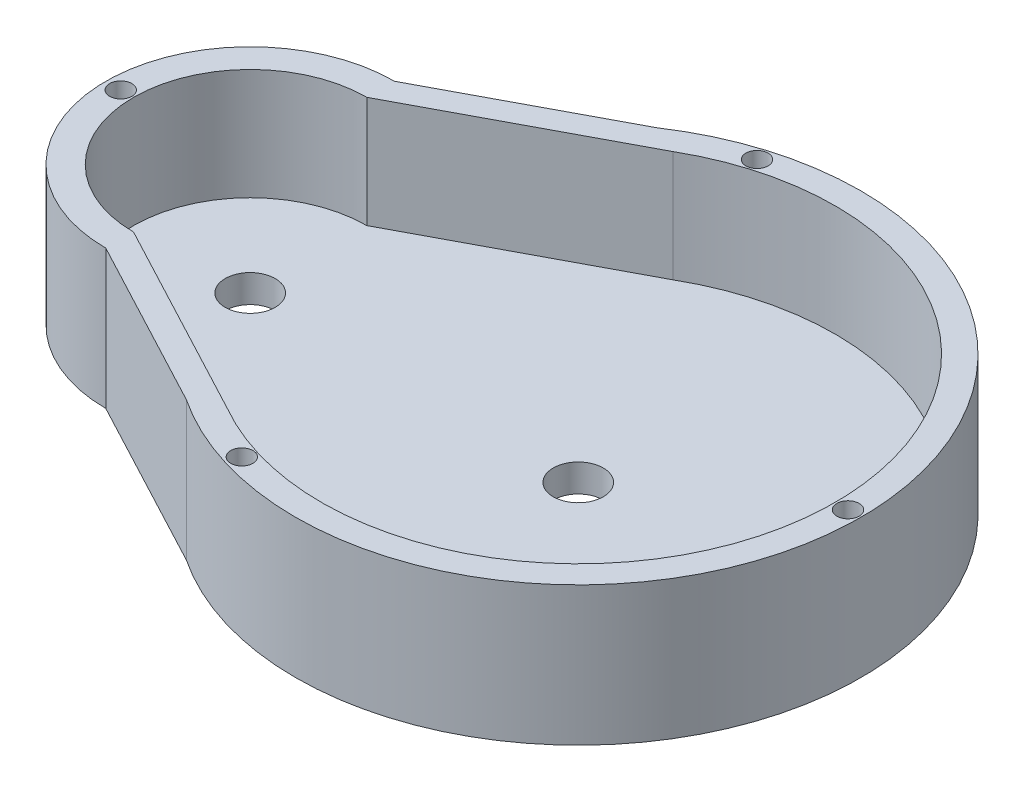
ISO-10303-21;
HEADER;
FILE_DESCRIPTION(('STEP AP214'),'2;1');
FILE_NAME('part.step','',(''),(''),'','','');
FILE_SCHEMA(('AUTOMOTIVE_DESIGN { 1 0 10303 214 1 1 1 1 }'));
ENDSEC;
DATA;
#1=APPLICATION_CONTEXT('core data for automotive mechanical design processes');
#2=APPLICATION_PROTOCOL_DEFINITION('international standard','automotive_design',2000,#1);
#3=PRODUCT_CONTEXT('',#1,'mechanical');
#4=PRODUCT('Part','Part','',(#3));
#5=PRODUCT_RELATED_PRODUCT_CATEGORY('part','',(#4));
#6=PRODUCT_DEFINITION_FORMATION('','',#4);
#7=PRODUCT_DEFINITION_CONTEXT('part definition',#1,'design');
#8=PRODUCT_DEFINITION('design','',#6,#7);
#9=PRODUCT_DEFINITION_SHAPE('','',#8);
#10=(LENGTH_UNIT() NAMED_UNIT(*) SI_UNIT(.MILLI.,.METRE.));
#11=(NAMED_UNIT(*) PLANE_ANGLE_UNIT() SI_UNIT($,.RADIAN.));
#12=(NAMED_UNIT(*) SI_UNIT($,.STERADIAN.) SOLID_ANGLE_UNIT());
#13=UNCERTAINTY_MEASURE_WITH_UNIT(LENGTH_MEASURE(1.E-05),#10,'distance_accuracy_value','');
#14=(GEOMETRIC_REPRESENTATION_CONTEXT(3) GLOBAL_UNCERTAINTY_ASSIGNED_CONTEXT((#13)) GLOBAL_UNIT_ASSIGNED_CONTEXT((#10,
#11,#12)) REPRESENTATION_CONTEXT('',''));
#15=CARTESIAN_POINT('',(0.,0.,0.));
#16=DIRECTION('',(0.,0.,1.));
#17=DIRECTION('',(1.,0.,0.));
#18=AXIS2_PLACEMENT_3D('',#15,#16,#17);
#19=CARTESIAN_POINT('',(0.,5.,0.));
#20=DIRECTION('',(0.,1.,0.));
#21=DIRECTION('',(0.,0.,1.));
#22=AXIS2_PLACEMENT_3D('',#19,#20,#21);
#23=PLANE('',#22);
#24=CARTESIAN_POINT('',(59.055,5.,0.));
#25=DIRECTION('',(0.,1.,0.));
#26=DIRECTION('',(0.,0.,1.));
#27=AXIS2_PLACEMENT_3D('',#24,#25,#26);
#28=CIRCLE('',#27,4.5);
#29=CARTESIAN_POINT('',(59.055,5.,4.5));
#30=VERTEX_POINT('',#29);
#31=EDGE_CURVE('E159',#30,#30,#28,.T.);
#32=ORIENTED_EDGE('',*,*,#31,.F.);
#33=EDGE_LOOP('',(#32));
#34=FACE_BOUND('',#33,.T.);
#35=CARTESIAN_POINT('',(0.,5.,0.));
#36=DIRECTION('',(0.,1.,0.));
#37=DIRECTION('',(0.,0.,1.));
#38=AXIS2_PLACEMENT_3D('',#35,#36,#37);
#39=CIRCLE('',#38,4.5);
#40=CARTESIAN_POINT('',(0.,5.,4.5));
#41=VERTEX_POINT('',#40);
#42=EDGE_CURVE('E156',#41,#41,#39,.T.);
#43=ORIENTED_EDGE('',*,*,#42,.F.);
#44=EDGE_LOOP('',(#43));
#45=FACE_BOUND('',#44,.T.);
#46=CARTESIAN_POINT('',(59.055,5.,0.));
#47=DIRECTION('',(0.,1.,0.));
#48=DIRECTION('',(0.,0.,1.));
#49=AXIS2_PLACEMENT_3D('',#46,#47,#48);
#50=CIRCLE('',#49,46.2469937677163);
#51=CARTESIAN_POINT('',(35.9898259140856,5.,40.0846875619313));
#52=VERTEX_POINT('',#51);
#53=CARTESIAN_POINT('',(35.9898259140857,5.,-40.0846875619313));
#54=VERTEX_POINT('',#53);
#55=EDGE_CURVE('E54',#52,#54,#50,.T.);
#56=ORIENTED_EDGE('',*,*,#55,.T.);
#57=DIRECTION('',(0.883470496277918,0.,-0.468486800461283));
#58=VECTOR('',#57,1.);
#59=CARTESIAN_POINT('',(-8.69177958816686,5.,-16.3909224736645));
#60=LINE('',#59,#58);
#61=CARTESIAN_POINT('',(0.,5.,-21.));
#62=VERTEX_POINT('',#61);
#63=EDGE_CURVE('E121',#62,#54,#60,.T.);
#64=ORIENTED_EDGE('',*,*,#63,.F.);
#65=CARTESIAN_POINT('',(0.,5.,0.));
#66=DIRECTION('',(0.,1.,0.));
#67=DIRECTION('',(0.,0.,1.));
#68=AXIS2_PLACEMENT_3D('',#65,#66,#67);
#69=CIRCLE('',#68,21.);
#70=CARTESIAN_POINT('',(0.,5.,21.));
#71=VERTEX_POINT('',#70);
#72=EDGE_CURVE('E116',#62,#71,#69,.T.);
#73=ORIENTED_EDGE('',*,*,#72,.T.);
#74=DIRECTION('',(0.883470496277919,0.,0.468486800461281));
#75=VECTOR('',#74,1.);
#76=CARTESIAN_POINT('',(-8.69177958816683,5.,16.3909224736646));
#77=LINE('',#76,#75);
#78=EDGE_CURVE('E59',#71,#52,#77,.T.);
#79=ORIENTED_EDGE('',*,*,#78,.T.);
#80=EDGE_LOOP('',(#56,#64,#73,#79));
#81=FACE_BOUND('',#80,.T.);
#82=ADVANCED_FACE('F39',(#34,#45,#81),#23,.T.);
#83=CARTESIAN_POINT('',(-10.7612509186828,5.,20.2935230626323));
#84=DIRECTION('',(0.468486800461283,0.,-0.883470496277918));
#85=DIRECTION('',(-0.883470496277918,0.,-0.468486800461283));
#86=AXIS2_PLACEMENT_3D('',#83,#84,#85);
#87=PLANE('',#86);
#88=DIRECTION('',(0.883470496277918,0.,0.468486800461283));
#89=VECTOR('',#88,1.);
#90=CARTESIAN_POINT('',(-10.7612509186828,0.,20.2935230626323));
#91=LINE('',#90,#89);
#92=CARTESIAN_POINT('',(0.,0.,26.));
#93=VERTEX_POINT('',#92);
#94=CARTESIAN_POINT('',(30.8523245113899,0.,42.3603729360844));
#95=VERTEX_POINT('',#94);
#96=EDGE_CURVE('E123',#93,#95,#91,.T.);
#97=ORIENTED_EDGE('',*,*,#96,.T.);
#98=DIRECTION('',(0.,-1.,0.));
#99=VECTOR('',#98,1.);
#100=CARTESIAN_POINT('',(30.8523245113899,5.,42.3603729360844));
#101=LINE('',#100,#99);
#102=CARTESIAN_POINT('',(30.8523245113898,25.,42.3603729360843));
#103=VERTEX_POINT('',#102);
#104=EDGE_CURVE('E12',#103,#95,#101,.T.);
#105=ORIENTED_EDGE('',*,*,#104,.F.);
#106=DIRECTION('',(0.883470496277918,0.,0.468486800461283));
#107=VECTOR('',#106,1.);
#108=CARTESIAN_POINT('',(-10.7612509186828,25.,20.2935230626323));
#109=LINE('',#108,#107);
#110=CARTESIAN_POINT('',(0.,25.,26.));
#111=VERTEX_POINT('',#110);
#112=EDGE_CURVE('E142',#111,#103,#109,.T.);
#113=ORIENTED_EDGE('',*,*,#112,.F.);
#114=DIRECTION('',(0.,-1.,0.));
#115=VECTOR('',#114,1.);
#116=CARTESIAN_POINT('',(0.,5.,26.));
#117=LINE('',#116,#115);
#118=EDGE_CURVE('E163',#111,#93,#117,.T.);
#119=ORIENTED_EDGE('',*,*,#118,.T.);
#120=EDGE_LOOP('',(#97,#105,#113,#119));
#121=FACE_BOUND('',#120,.T.);
#122=ADVANCED_FACE('F41',(#121),#87,.F.);
#123=CARTESIAN_POINT('',(59.055,5.,0.));
#124=DIRECTION('',(0.,-1.,0.));
#125=DIRECTION('',(0.,0.,-1.));
#126=AXIS2_PLACEMENT_3D('',#123,#124,#125);
#127=CYLINDRICAL_SURFACE('',#126,50.89);
#128=CARTESIAN_POINT('',(59.055,0.,0.));
#129=DIRECTION('',(0.,1.,0.));
#130=DIRECTION('',(0.,0.,1.));
#131=AXIS2_PLACEMENT_3D('',#128,#129,#130);
#132=CIRCLE('',#131,50.89);
#133=CARTESIAN_POINT('',(30.8523245113899,0.,-42.3603729360844));
#134=VERTEX_POINT('',#133);
#135=EDGE_CURVE('E166',#95,#134,#132,.T.);
#136=ORIENTED_EDGE('',*,*,#135,.T.);
#137=DIRECTION('',(0.,-1.,0.));
#138=VECTOR('',#137,1.);
#139=CARTESIAN_POINT('',(30.8523245113899,5.,-42.3603729360844));
#140=LINE('',#139,#138);
#141=CARTESIAN_POINT('',(30.8523245113899,25.,-42.3603729360844));
#142=VERTEX_POINT('',#141);
#143=EDGE_CURVE('E47',#142,#134,#140,.T.);
#144=ORIENTED_EDGE('',*,*,#143,.F.);
#145=CARTESIAN_POINT('',(59.055,25.,0.));
#146=DIRECTION('',(0.,1.,0.));
#147=DIRECTION('',(0.,0.,1.));
#148=AXIS2_PLACEMENT_3D('',#145,#146,#147);
#149=CIRCLE('',#148,50.89);
#150=EDGE_CURVE('E133',#103,#142,#149,.T.);
#151=ORIENTED_EDGE('',*,*,#150,.F.);
#152=ORIENTED_EDGE('',*,*,#104,.T.);
#153=EDGE_LOOP('',(#136,#144,#151,#152));
#154=FACE_BOUND('',#153,.T.);
#155=ADVANCED_FACE('F188',(#154),#127,.T.);
#156=CARTESIAN_POINT('',(-10.7612509186828,5.,-20.2935230626323));
#157=DIRECTION('',(-0.468486800461283,0.,-0.883470496277917));
#158=DIRECTION('',(-0.883470496277917,0.,0.468486800461283));
#159=AXIS2_PLACEMENT_3D('',#156,#157,#158);
#160=PLANE('',#159);
#161=DIRECTION('',(0.883470496277917,0.,-0.468486800461283));
#162=VECTOR('',#161,1.);
#163=CARTESIAN_POINT('',(-10.7612509186828,0.,-20.2935230626323));
#164=LINE('',#163,#162);
#165=CARTESIAN_POINT('',(0.,0.,-26.));
#166=VERTEX_POINT('',#165);
#167=EDGE_CURVE('E169',#166,#134,#164,.T.);
#168=ORIENTED_EDGE('',*,*,#167,.F.);
#169=DIRECTION('',(0.,-1.,0.));
#170=VECTOR('',#169,1.);
#171=CARTESIAN_POINT('',(0.,5.,-26.));
#172=LINE('',#171,#170);
#173=CARTESIAN_POINT('',(0.,25.,-26.));
#174=VERTEX_POINT('',#173);
#175=EDGE_CURVE('E181',#174,#166,#172,.T.);
#176=ORIENTED_EDGE('',*,*,#175,.F.);
#177=DIRECTION('',(-0.883470496277917,0.,0.468486800461283));
#178=VECTOR('',#177,1.);
#179=CARTESIAN_POINT('',(-10.7612509186828,25.,-20.2935230626323));
#180=LINE('',#179,#178);
#181=EDGE_CURVE('E136',#142,#174,#180,.T.);
#182=ORIENTED_EDGE('',*,*,#181,.F.);
#183=ORIENTED_EDGE('',*,*,#143,.T.);
#184=EDGE_LOOP('',(#168,#176,#182,#183));
#185=FACE_BOUND('',#184,.T.);
#186=ADVANCED_FACE('F185',(#185),#160,.T.);
#187=CARTESIAN_POINT('',(0.,5.,0.));
#188=DIRECTION('',(0.,-1.,0.));
#189=DIRECTION('',(0.,0.,-1.));
#190=AXIS2_PLACEMENT_3D('',#187,#188,#189);
#191=CYLINDRICAL_SURFACE('',#190,4.5);
#192=ORIENTED_EDGE('',*,*,#42,.T.);
#193=EDGE_LOOP('',(#192));
#194=FACE_BOUND('',#193,.T.);
#195=CARTESIAN_POINT('',(0.,0.,0.));
#196=DIRECTION('',(0.,1.,0.));
#197=DIRECTION('',(0.,0.,1.));
#198=AXIS2_PLACEMENT_3D('',#195,#196,#197);
#199=CIRCLE('',#198,4.5);
#200=CARTESIAN_POINT('',(0.,0.,4.5));
#201=VERTEX_POINT('',#200);
#202=EDGE_CURVE('E175',#201,#201,#199,.T.);
#203=ORIENTED_EDGE('',*,*,#202,.F.);
#204=EDGE_LOOP('',(#203));
#205=FACE_BOUND('',#204,.T.);
#206=ADVANCED_FACE('F220',(#194,#205),#191,.F.);
#207=CARTESIAN_POINT('',(0.,5.,0.));
#208=DIRECTION('',(0.,-1.,0.));
#209=DIRECTION('',(0.,0.,-1.));
#210=AXIS2_PLACEMENT_3D('',#207,#208,#209);
#211=CYLINDRICAL_SURFACE('',#210,26.);
#212=CARTESIAN_POINT('',(0.,0.,0.));
#213=DIRECTION('',(0.,1.,0.));
#214=DIRECTION('',(0.,0.,1.));
#215=AXIS2_PLACEMENT_3D('',#212,#213,#214);
#216=CIRCLE('',#215,26.);
#217=EDGE_CURVE('E172',#93,#166,#216,.F.);
#218=ORIENTED_EDGE('',*,*,#217,.F.);
#219=ORIENTED_EDGE('',*,*,#118,.F.);
#220=CARTESIAN_POINT('',(0.,25.,0.));
#221=DIRECTION('',(0.,1.,0.));
#222=DIRECTION('',(0.,0.,1.));
#223=AXIS2_PLACEMENT_3D('',#220,#221,#222);
#224=CIRCLE('',#223,26.);
#225=EDGE_CURVE('E139',#174,#111,#224,.T.);
#226=ORIENTED_EDGE('',*,*,#225,.F.);
#227=ORIENTED_EDGE('',*,*,#175,.T.);
#228=EDGE_LOOP('',(#218,#219,#226,#227));
#229=FACE_BOUND('',#228,.T.);
#230=ADVANCED_FACE('F195',(#229),#211,.T.);
#231=CARTESIAN_POINT('',(59.055,5.,0.));
#232=DIRECTION('',(0.,-1.,0.));
#233=DIRECTION('',(0.,0.,-1.));
#234=AXIS2_PLACEMENT_3D('',#231,#232,#233);
#235=CYLINDRICAL_SURFACE('',#234,4.5);
#236=ORIENTED_EDGE('',*,*,#31,.T.);
#237=EDGE_LOOP('',(#236));
#238=FACE_BOUND('',#237,.T.);
#239=CARTESIAN_POINT('',(59.055,0.,0.));
#240=DIRECTION('',(0.,1.,0.));
#241=DIRECTION('',(0.,0.,1.));
#242=AXIS2_PLACEMENT_3D('',#239,#240,#241);
#243=CIRCLE('',#242,4.5);
#244=CARTESIAN_POINT('',(59.055,0.,4.5));
#245=VERTEX_POINT('',#244);
#246=EDGE_CURVE('E160',#245,#245,#243,.T.);
#247=ORIENTED_EDGE('',*,*,#246,.F.);
#248=EDGE_LOOP('',(#247));
#249=FACE_BOUND('',#248,.T.);
#250=ADVANCED_FACE('F215',(#238,#249),#235,.F.);
#251=CARTESIAN_POINT('',(0.,0.,0.));
#252=DIRECTION('',(0.,1.,0.));
#253=DIRECTION('',(0.,0.,1.));
#254=AXIS2_PLACEMENT_3D('',#251,#252,#253);
#255=PLANE('',#254);
#256=CARTESIAN_POINT('',(-23.3,0.,0.));
#257=DIRECTION('',(0.,1.,0.));
#258=DIRECTION('',(0.,0.,1.));
#259=AXIS2_PLACEMENT_3D('',#256,#257,#258);
#260=CIRCLE('',#259,2.);
#261=CARTESIAN_POINT('',(-23.3,0.,2.));
#262=VERTEX_POINT('',#261);
#263=EDGE_CURVE('E147',#262,#262,#260,.T.);
#264=ORIENTED_EDGE('',*,*,#263,.T.);
#265=EDGE_LOOP('',(#264));
#266=FACE_BOUND('',#265,.T.);
#267=CARTESIAN_POINT('',(107.605,0.,0.));
#268=DIRECTION('',(0.,1.,0.));
#269=DIRECTION('',(0.,0.,1.));
#270=AXIS2_PLACEMENT_3D('',#267,#268,#269);
#271=CIRCLE('',#270,2.);
#272=CARTESIAN_POINT('',(107.605,0.,2.));
#273=VERTEX_POINT('',#272);
#274=EDGE_CURVE('E463',#273,#273,#271,.T.);
#275=ORIENTED_EDGE('',*,*,#274,.T.);
#276=EDGE_LOOP('',(#275));
#277=FACE_BOUND('',#276,.T.);
#278=CARTESIAN_POINT('',(44.8118478498742,0.,-46.4228622133697));
#279=DIRECTION('',(0.,1.,0.));
#280=DIRECTION('',(0.,0.,1.));
#281=AXIS2_PLACEMENT_3D('',#278,#279,#280);
#282=CIRCLE('',#281,2.);
#283=CARTESIAN_POINT('',(44.8118478498742,0.,-44.4228622133697));
#284=VERTEX_POINT('',#283);
#285=EDGE_CURVE('E465',#284,#284,#282,.T.);
#286=ORIENTED_EDGE('',*,*,#285,.T.);
#287=EDGE_LOOP('',(#286));
#288=FACE_BOUND('',#287,.T.);
#289=CARTESIAN_POINT('',(44.8118478498742,0.,46.3169661641118));
#290=DIRECTION('',(0.,1.,0.));
#291=DIRECTION('',(0.,0.,1.));
#292=AXIS2_PLACEMENT_3D('',#289,#290,#291);
#293=CIRCLE('',#292,2.);
#294=CARTESIAN_POINT('',(44.8118478498742,0.,48.3169661641118));
#295=VERTEX_POINT('',#294);
#296=EDGE_CURVE('E470',#295,#295,#293,.T.);
#297=ORIENTED_EDGE('',*,*,#296,.T.);
#298=EDGE_LOOP('',(#297));
#299=FACE_BOUND('',#298,.T.);
#300=ORIENTED_EDGE('',*,*,#96,.F.);
#301=ORIENTED_EDGE('',*,*,#217,.T.);
#302=ORIENTED_EDGE('',*,*,#167,.T.);
#303=ORIENTED_EDGE('',*,*,#135,.F.);
#304=EDGE_LOOP('',(#300,#301,#302,#303));
#305=FACE_BOUND('',#304,.T.);
#306=ORIENTED_EDGE('',*,*,#202,.T.);
#307=EDGE_LOOP('',(#306));
#308=FACE_BOUND('',#307,.T.);
#309=ORIENTED_EDGE('',*,*,#246,.T.);
#310=EDGE_LOOP('',(#309));
#311=FACE_BOUND('',#310,.T.);
#312=ADVANCED_FACE('F191',(#266,#277,#288,#299,#305,#308,#311),#255,.F.);
#313=CARTESIAN_POINT('',(-8.69177958816686,25.,-16.3909224736645));
#314=DIRECTION('',(-0.468486800461283,0.,-0.883470496277918));
#315=DIRECTION('',(-0.883470496277918,0.,0.468486800461283));
#316=AXIS2_PLACEMENT_3D('',#313,#314,#315);
#317=PLANE('',#316);
#318=ORIENTED_EDGE('',*,*,#63,.T.);
#319=DIRECTION('',(0.,-1.,0.));
#320=VECTOR('',#319,1.);
#321=CARTESIAN_POINT('',(35.9898259140856,25.,-40.0846875619314));
#322=LINE('',#321,#320);
#323=CARTESIAN_POINT('',(35.9898259140856,25.,-40.0846875619314));
#324=VERTEX_POINT('',#323);
#325=EDGE_CURVE('E119',#324,#54,#322,.T.);
#326=ORIENTED_EDGE('',*,*,#325,.F.);
#327=DIRECTION('',(0.883470496277918,0.,-0.468486800461283));
#328=VECTOR('',#327,1.);
#329=CARTESIAN_POINT('',(-8.69177958816686,25.,-16.3909224736645));
#330=LINE('',#329,#328);
#331=CARTESIAN_POINT('',(0.,25.,-21.));
#332=VERTEX_POINT('',#331);
#333=EDGE_CURVE('E104',#332,#324,#330,.T.);
#334=ORIENTED_EDGE('',*,*,#333,.F.);
#335=DIRECTION('',(0.,-1.,0.));
#336=VECTOR('',#335,1.);
#337=CARTESIAN_POINT('',(0.,25.,-21.));
#338=LINE('',#337,#336);
#339=EDGE_CURVE('E145',#332,#62,#338,.T.);
#340=ORIENTED_EDGE('',*,*,#339,.T.);
#341=EDGE_LOOP('',(#318,#326,#334,#340));
#342=FACE_BOUND('',#341,.T.);
#343=ADVANCED_FACE('F120',(#342),#317,.F.);
#344=CARTESIAN_POINT('',(59.055,25.,0.));
#345=DIRECTION('',(0.,-1.,0.));
#346=DIRECTION('',(0.,0.,-1.));
#347=AXIS2_PLACEMENT_3D('',#344,#345,#346);
#348=CYLINDRICAL_SURFACE('',#347,46.2469937677163);
#349=ORIENTED_EDGE('',*,*,#55,.F.);
#350=DIRECTION('',(0.,-1.,0.));
#351=VECTOR('',#350,1.);
#352=CARTESIAN_POINT('',(35.9898259140856,25.,40.0846875619313));
#353=LINE('',#352,#351);
#354=CARTESIAN_POINT('',(35.9898259140856,25.,40.0846875619313));
#355=VERTEX_POINT('',#354);
#356=EDGE_CURVE('E124',#355,#52,#353,.T.);
#357=ORIENTED_EDGE('',*,*,#356,.F.);
#358=CARTESIAN_POINT('',(59.055,25.,0.));
#359=DIRECTION('',(0.,1.,0.));
#360=DIRECTION('',(0.,0.,1.));
#361=AXIS2_PLACEMENT_3D('',#358,#359,#360);
#362=CIRCLE('',#361,46.2469937677163);
#363=EDGE_CURVE('E110',#355,#324,#362,.T.);
#364=ORIENTED_EDGE('',*,*,#363,.T.);
#365=ORIENTED_EDGE('',*,*,#325,.T.);
#366=EDGE_LOOP('',(#349,#357,#364,#365));
#367=FACE_BOUND('',#366,.T.);
#368=ADVANCED_FACE('F126',(#367),#348,.F.);
#369=CARTESIAN_POINT('',(-8.69177958816683,25.,16.3909224736646));
#370=DIRECTION('',(0.468486800461281,0.,-0.883470496277919));
#371=DIRECTION('',(-0.883470496277919,0.,-0.468486800461281));
#372=AXIS2_PLACEMENT_3D('',#369,#370,#371);
#373=PLANE('',#372);
#374=ORIENTED_EDGE('',*,*,#78,.F.);
#375=DIRECTION('',(0.,-1.,0.));
#376=VECTOR('',#375,1.);
#377=CARTESIAN_POINT('',(0.,25.,21.));
#378=LINE('',#377,#376);
#379=CARTESIAN_POINT('',(0.,25.,21.));
#380=VERTEX_POINT('',#379);
#381=EDGE_CURVE('E152',#380,#71,#378,.T.);
#382=ORIENTED_EDGE('',*,*,#381,.F.);
#383=DIRECTION('',(0.883470496277919,0.,0.468486800461281));
#384=VECTOR('',#383,1.);
#385=CARTESIAN_POINT('',(-8.69177958816683,25.,16.3909224736646));
#386=LINE('',#385,#384);
#387=EDGE_CURVE('E127',#380,#355,#386,.T.);
#388=ORIENTED_EDGE('',*,*,#387,.T.);
#389=ORIENTED_EDGE('',*,*,#356,.T.);
#390=EDGE_LOOP('',(#374,#382,#388,#389));
#391=FACE_BOUND('',#390,.T.);
#392=ADVANCED_FACE('F260',(#391),#373,.T.);
#393=CARTESIAN_POINT('',(0.,25.,0.));
#394=DIRECTION('',(0.,-1.,0.));
#395=DIRECTION('',(0.,0.,-1.));
#396=AXIS2_PLACEMENT_3D('',#393,#394,#395);
#397=CYLINDRICAL_SURFACE('',#396,21.);
#398=ORIENTED_EDGE('',*,*,#72,.F.);
#399=ORIENTED_EDGE('',*,*,#339,.F.);
#400=CARTESIAN_POINT('',(0.,25.,0.));
#401=DIRECTION('',(0.,1.,0.));
#402=DIRECTION('',(0.,0.,1.));
#403=AXIS2_PLACEMENT_3D('',#400,#401,#402);
#404=CIRCLE('',#403,21.);
#405=EDGE_CURVE('E113',#332,#380,#404,.T.);
#406=ORIENTED_EDGE('',*,*,#405,.T.);
#407=ORIENTED_EDGE('',*,*,#381,.T.);
#408=EDGE_LOOP('',(#398,#399,#406,#407));
#409=FACE_BOUND('',#408,.T.);
#410=ADVANCED_FACE('F266',(#409),#397,.F.);
#411=CARTESIAN_POINT('',(0.,25.,0.));
#412=DIRECTION('',(0.,1.,0.));
#413=DIRECTION('',(0.,0.,1.));
#414=AXIS2_PLACEMENT_3D('',#411,#412,#413);
#415=PLANE('',#414);
#416=CARTESIAN_POINT('',(-23.3,25.,0.));
#417=DIRECTION('',(0.,1.,0.));
#418=DIRECTION('',(0.,0.,1.));
#419=AXIS2_PLACEMENT_3D('',#416,#417,#418);
#420=CIRCLE('',#419,2.);
#421=CARTESIAN_POINT('',(-23.3,25.,2.));
#422=VERTEX_POINT('',#421);
#423=EDGE_CURVE('E460',#422,#422,#420,.T.);
#424=ORIENTED_EDGE('',*,*,#423,.F.);
#425=EDGE_LOOP('',(#424));
#426=FACE_BOUND('',#425,.T.);
#427=CARTESIAN_POINT('',(107.605,25.,0.));
#428=DIRECTION('',(0.,1.,0.));
#429=DIRECTION('',(0.,0.,1.));
#430=AXIS2_PLACEMENT_3D('',#427,#428,#429);
#431=CIRCLE('',#430,2.);
#432=CARTESIAN_POINT('',(107.605,25.,2.));
#433=VERTEX_POINT('',#432);
#434=EDGE_CURVE('E479',#433,#433,#431,.T.);
#435=ORIENTED_EDGE('',*,*,#434,.F.);
#436=EDGE_LOOP('',(#435));
#437=FACE_BOUND('',#436,.T.);
#438=CARTESIAN_POINT('',(44.8118478498742,25.,-46.4228622133697));
#439=DIRECTION('',(0.,1.,0.));
#440=DIRECTION('',(0.,0.,1.));
#441=AXIS2_PLACEMENT_3D('',#438,#439,#440);
#442=CIRCLE('',#441,2.);
#443=CARTESIAN_POINT('',(44.8118478498742,25.,-44.4228622133697));
#444=VERTEX_POINT('',#443);
#445=EDGE_CURVE('E476',#444,#444,#442,.T.);
#446=ORIENTED_EDGE('',*,*,#445,.F.);
#447=EDGE_LOOP('',(#446));
#448=FACE_BOUND('',#447,.T.);
#449=CARTESIAN_POINT('',(44.8118478498742,25.,46.3169661641118));
#450=DIRECTION('',(0.,1.,0.));
#451=DIRECTION('',(0.,0.,1.));
#452=AXIS2_PLACEMENT_3D('',#449,#450,#451);
#453=CIRCLE('',#452,2.);
#454=CARTESIAN_POINT('',(44.8118478498742,25.,48.3169661641118));
#455=VERTEX_POINT('',#454);
#456=EDGE_CURVE('E473',#455,#455,#453,.T.);
#457=ORIENTED_EDGE('',*,*,#456,.F.);
#458=EDGE_LOOP('',(#457));
#459=FACE_BOUND('',#458,.T.);
#460=ORIENTED_EDGE('',*,*,#333,.T.);
#461=ORIENTED_EDGE('',*,*,#363,.F.);
#462=ORIENTED_EDGE('',*,*,#387,.F.);
#463=ORIENTED_EDGE('',*,*,#405,.F.);
#464=EDGE_LOOP('',(#460,#461,#462,#463));
#465=FACE_BOUND('',#464,.T.);
#466=ORIENTED_EDGE('',*,*,#150,.T.);
#467=ORIENTED_EDGE('',*,*,#181,.T.);
#468=ORIENTED_EDGE('',*,*,#225,.T.);
#469=ORIENTED_EDGE('',*,*,#112,.T.);
#470=EDGE_LOOP('',(#466,#467,#468,#469));
#471=FACE_BOUND('',#470,.T.);
#472=ADVANCED_FACE('F106',(#426,#437,#448,#459,#465,#471),#415,.T.);
#473=CARTESIAN_POINT('',(44.8118478498742,-15.,46.3169661641118));
#474=DIRECTION('',(0.,1.,0.));
#475=DIRECTION('',(0.,0.,1.));
#476=AXIS2_PLACEMENT_3D('',#473,#474,#475);
#477=CYLINDRICAL_SURFACE('',#476,2.);
#478=ORIENTED_EDGE('',*,*,#456,.T.);
#479=EDGE_LOOP('',(#478));
#480=FACE_BOUND('',#479,.T.);
#481=ORIENTED_EDGE('',*,*,#296,.F.);
#482=EDGE_LOOP('',(#481));
#483=FACE_BOUND('',#482,.T.);
#484=ADVANCED_FACE('F279',(#480,#483),#477,.F.);
#485=CARTESIAN_POINT('',(44.8118478498742,-15.,-46.4228622133697));
#486=DIRECTION('',(0.,1.,0.));
#487=DIRECTION('',(0.,0.,1.));
#488=AXIS2_PLACEMENT_3D('',#485,#486,#487);
#489=CYLINDRICAL_SURFACE('',#488,2.);
#490=ORIENTED_EDGE('',*,*,#445,.T.);
#491=EDGE_LOOP('',(#490));
#492=FACE_BOUND('',#491,.T.);
#493=ORIENTED_EDGE('',*,*,#285,.F.);
#494=EDGE_LOOP('',(#493));
#495=FACE_BOUND('',#494,.T.);
#496=ADVANCED_FACE('F287',(#492,#495),#489,.F.);
#497=CARTESIAN_POINT('',(107.605,-15.,0.));
#498=DIRECTION('',(0.,1.,0.));
#499=DIRECTION('',(0.,0.,1.));
#500=AXIS2_PLACEMENT_3D('',#497,#498,#499);
#501=CYLINDRICAL_SURFACE('',#500,2.);
#502=ORIENTED_EDGE('',*,*,#434,.T.);
#503=EDGE_LOOP('',(#502));
#504=FACE_BOUND('',#503,.T.);
#505=ORIENTED_EDGE('',*,*,#274,.F.);
#506=EDGE_LOOP('',(#505));
#507=FACE_BOUND('',#506,.T.);
#508=ADVANCED_FACE('F295',(#504,#507),#501,.F.);
#509=CARTESIAN_POINT('',(-23.3,-15.,0.));
#510=DIRECTION('',(0.,1.,0.));
#511=DIRECTION('',(0.,0.,1.));
#512=AXIS2_PLACEMENT_3D('',#509,#510,#511);
#513=CYLINDRICAL_SURFACE('',#512,2.);
#514=ORIENTED_EDGE('',*,*,#423,.T.);
#515=EDGE_LOOP('',(#514));
#516=FACE_BOUND('',#515,.T.);
#517=ORIENTED_EDGE('',*,*,#263,.F.);
#518=EDGE_LOOP('',(#517));
#519=FACE_BOUND('',#518,.T.);
#520=ADVANCED_FACE('F303',(#516,#519),#513,.F.);
#521=CLOSED_SHELL('',(#82,#122,#155,#186,#206,#230,#250,#312,#343,#368,#392,#410,#472,#484,#496,
#508,#520));
#522=MANIFOLD_SOLID_BREP('B2',#521);
#523=ADVANCED_BREP_SHAPE_REPRESENTATION('',(#18,#522),#14);
#524=SHAPE_DEFINITION_REPRESENTATION(#9,#523);
ENDSEC;
END-ISO-10303-21;
